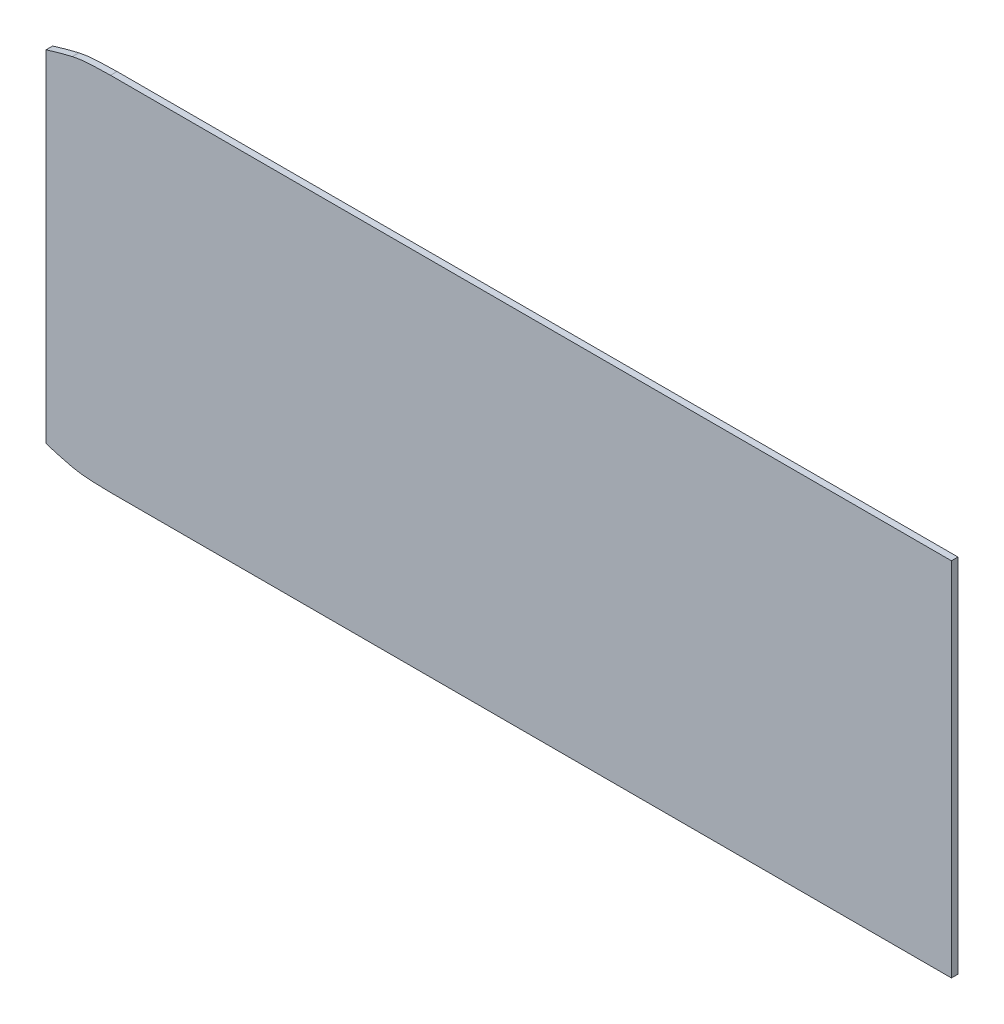
ISO-10303-21;
HEADER;
FILE_DESCRIPTION(('STEP AP214'),'2;1');
FILE_NAME('part.step','',(''),(''),'','','');
FILE_SCHEMA(('AUTOMOTIVE_DESIGN { 1 0 10303 214 1 1 1 1 }'));
ENDSEC;
DATA;
#1=APPLICATION_CONTEXT('core data for automotive mechanical design processes');
#2=APPLICATION_PROTOCOL_DEFINITION('international standard','automotive_design',2000,#1);
#3=PRODUCT_CONTEXT('',#1,'mechanical');
#4=PRODUCT('Part','Part','',(#3));
#5=PRODUCT_RELATED_PRODUCT_CATEGORY('part','',(#4));
#6=PRODUCT_DEFINITION_FORMATION('','',#4);
#7=PRODUCT_DEFINITION_CONTEXT('part definition',#1,'design');
#8=PRODUCT_DEFINITION('design','',#6,#7);
#9=PRODUCT_DEFINITION_SHAPE('','',#8);
#10=(LENGTH_UNIT() NAMED_UNIT(*) SI_UNIT(.MILLI.,.METRE.));
#11=(NAMED_UNIT(*) PLANE_ANGLE_UNIT() SI_UNIT($,.RADIAN.));
#12=(NAMED_UNIT(*) SI_UNIT($,.STERADIAN.) SOLID_ANGLE_UNIT());
#13=UNCERTAINTY_MEASURE_WITH_UNIT(LENGTH_MEASURE(1.E-05),#10,'distance_accuracy_value','');
#14=(GEOMETRIC_REPRESENTATION_CONTEXT(3) GLOBAL_UNCERTAINTY_ASSIGNED_CONTEXT((#13)) GLOBAL_UNIT_ASSIGNED_CONTEXT((#10,
#11,#12)) REPRESENTATION_CONTEXT('',''));
#15=CARTESIAN_POINT('',(0.,0.,0.));
#16=DIRECTION('',(0.,0.,1.));
#17=DIRECTION('',(1.,0.,0.));
#18=AXIS2_PLACEMENT_3D('',#15,#16,#17);
#19=CARTESIAN_POINT('',(158.,83.,3.));
#20=DIRECTION('',(0.,-1.,0.));
#21=DIRECTION('',(0.,0.,-1.));
#22=AXIS2_PLACEMENT_3D('',#19,#20,#21);
#23=PLANE('',#22);
#24=DIRECTION('',(-1.,0.,0.));
#25=VECTOR('',#24,1.);
#26=CARTESIAN_POINT('',(158.,83.,3.));
#27=LINE('',#26,#25);
#28=CARTESIAN_POINT('',(157.984004842846,83.,3.));
#29=VERTEX_POINT('',#28);
#30=CARTESIAN_POINT('',(-228.37389849842,82.9999998793761,3.));
#31=VERTEX_POINT('',#30);
#32=EDGE_CURVE('E124',#29,#31,#27,.T.);
#33=ORIENTED_EDGE('',*,*,#32,.F.);
#34=DIRECTION('',(0.,0.,-1.));
#35=VECTOR('',#34,1.);
#36=CARTESIAN_POINT('',(157.984004842846,83.,3.));
#37=LINE('',#36,#35);
#38=CARTESIAN_POINT('',(157.984004842846,83.,0.));
#39=VERTEX_POINT('',#38);
#40=EDGE_CURVE('E400',#29,#39,#37,.T.);
#41=ORIENTED_EDGE('',*,*,#40,.T.);
#42=DIRECTION('',(-1.,0.,0.));
#43=VECTOR('',#42,1.);
#44=CARTESIAN_POINT('',(158.,83.,0.));
#45=LINE('',#44,#43);
#46=CARTESIAN_POINT('',(-228.37389849842,82.9999998793761,0.));
#47=VERTEX_POINT('',#46);
#48=EDGE_CURVE('E222',#39,#47,#45,.T.);
#49=ORIENTED_EDGE('',*,*,#48,.T.);
#50=DIRECTION('',(0.,0.,-1.));
#51=VECTOR('',#50,1.);
#52=CARTESIAN_POINT('',(-228.37389849842,82.9999998793761,3.));
#53=LINE('',#52,#51);
#54=EDGE_CURVE('E307',#31,#47,#53,.T.);
#55=ORIENTED_EDGE('',*,*,#54,.F.);
#56=EDGE_LOOP('',(#33,#41,#49,#55));
#57=FACE_BOUND('',#56,.T.);
#58=ADVANCED_FACE('F121',(#57),#23,.F.);
#59=CARTESIAN_POINT('',(-258.,83.,3.));
#60=DIRECTION('',(1.,0.,0.));
#61=DIRECTION('',(0.,0.,-1.));
#62=AXIS2_PLACEMENT_3D('',#59,#60,#61);
#63=PLANE('',#62);
#64=DIRECTION('',(0.,-1.,0.));
#65=VECTOR('',#64,1.);
#66=CARTESIAN_POINT('',(-258.,83.,0.));
#67=LINE('',#66,#65);
#68=CARTESIAN_POINT('',(-257.999999903838,78.331787836265,0.));
#69=VERTEX_POINT('',#68);
#70=CARTESIAN_POINT('',(-258.000000000782,-78.3318450844403,0.));
#71=VERTEX_POINT('',#70);
#72=EDGE_CURVE('E333',#69,#71,#67,.T.);
#73=ORIENTED_EDGE('',*,*,#72,.T.);
#74=DIRECTION('',(0.,0.,-1.));
#75=VECTOR('',#74,1.);
#76=CARTESIAN_POINT('',(-258.,-78.3318657087253,3.));
#77=LINE('',#76,#75);
#78=CARTESIAN_POINT('',(-258.000000000785,-78.3318450844393,3.));
#79=VERTEX_POINT('',#78);
#80=EDGE_CURVE('E340',#71,#79,#77,.F.);
#81=ORIENTED_EDGE('',*,*,#80,.T.);
#82=DIRECTION('',(0.,-1.,0.));
#83=VECTOR('',#82,1.);
#84=CARTESIAN_POINT('',(-258.,83.,3.));
#85=LINE('',#84,#83);
#86=CARTESIAN_POINT('',(-257.999999903838,78.3317878362649,3.));
#87=VERTEX_POINT('',#86);
#88=EDGE_CURVE('E213',#87,#79,#85,.T.);
#89=ORIENTED_EDGE('',*,*,#88,.F.);
#90=DIRECTION('',(0.,0.,-1.));
#91=VECTOR('',#90,1.);
#92=CARTESIAN_POINT('',(-258.,78.3317881059395,3.));
#93=LINE('',#92,#91);
#94=EDGE_CURVE('E194',#87,#69,#93,.T.);
#95=ORIENTED_EDGE('',*,*,#94,.T.);
#96=EDGE_LOOP('',(#73,#81,#89,#95));
#97=FACE_BOUND('',#96,.T.);
#98=ADVANCED_FACE('F332',(#97),#63,.F.);
#99=CARTESIAN_POINT('',(-258.,-83.,3.));
#100=DIRECTION('',(0.,1.,0.));
#101=DIRECTION('',(0.,0.,1.));
#102=AXIS2_PLACEMENT_3D('',#99,#100,#101);
#103=PLANE('',#102);
#104=DIRECTION('',(1.,0.,0.));
#105=VECTOR('',#104,1.);
#106=CARTESIAN_POINT('',(-258.,-83.,3.));
#107=LINE('',#106,#105);
#108=CARTESIAN_POINT('',(-228.371279881388,-83.,3.));
#109=VERTEX_POINT('',#108);
#110=CARTESIAN_POINT('',(157.984004842846,-83.,3.));
#111=VERTEX_POINT('',#110);
#112=EDGE_CURVE('E352',#109,#111,#107,.T.);
#113=ORIENTED_EDGE('',*,*,#112,.F.);
#114=DIRECTION('',(0.,0.,-1.));
#115=VECTOR('',#114,1.);
#116=CARTESIAN_POINT('',(-228.371279881388,-83.,3.));
#117=LINE('',#116,#115);
#118=CARTESIAN_POINT('',(-228.371279881388,-83.,0.));
#119=VERTEX_POINT('',#118);
#120=EDGE_CURVE('E195',#109,#119,#117,.T.);
#121=ORIENTED_EDGE('',*,*,#120,.T.);
#122=DIRECTION('',(1.,0.,0.));
#123=VECTOR('',#122,1.);
#124=CARTESIAN_POINT('',(-258.,-83.,0.));
#125=LINE('',#124,#123);
#126=CARTESIAN_POINT('',(157.984004842846,-83.,0.));
#127=VERTEX_POINT('',#126);
#128=EDGE_CURVE('E337',#119,#127,#125,.T.);
#129=ORIENTED_EDGE('',*,*,#128,.T.);
#130=DIRECTION('',(0.,0.,1.));
#131=VECTOR('',#130,1.);
#132=CARTESIAN_POINT('',(157.984004842846,-83.,3.));
#133=LINE('',#132,#131);
#134=EDGE_CURVE('E334',#127,#111,#133,.T.);
#135=ORIENTED_EDGE('',*,*,#134,.T.);
#136=EDGE_LOOP('',(#113,#121,#129,#135));
#137=FACE_BOUND('',#136,.T.);
#138=ADVANCED_FACE('F234',(#137),#103,.F.);
#139=CARTESIAN_POINT('',(0.,0.,3.));
#140=DIRECTION('',(0.,0.,1.));
#141=DIRECTION('',(1.,0.,0.));
#142=AXIS2_PLACEMENT_3D('',#139,#140,#141);
#143=PLANE('',#142);
#144=CARTESIAN_POINT('',(-245.944918927692,-81.659654554092,3.));
#145=CARTESIAN_POINT('',(-248.243697448521,-81.1129730453286,3.));
#146=CARTESIAN_POINT('',(-250.534508221229,-80.5245902754165,3.));
#147=CARTESIAN_POINT('',(-254.54971348423,-79.3988032401642,3.));
#148=CARTESIAN_POINT('',(-256.278252151791,-78.8830885935074,3.));
#149=CARTESIAN_POINT('',(-258.000005989168,-78.3318637912749,3.));
#150=B_SPLINE_CURVE_WITH_KNOTS('',3,(#144,#145,#146,#147,#148,#149),.UNSPECIFIED.,.F.,.F.,(4,2,
4),(0.779967806411927,0.904967806411926,1.),.UNSPECIFIED.);
#151=CARTESIAN_POINT('',(-245.944918927692,-81.659654554092,3.));
#152=VERTEX_POINT('',#151);
#153=EDGE_CURVE('E189',#79,#152,#150,.F.);
#154=ORIENTED_EDGE('',*,*,#153,.T.);
#155=CARTESIAN_POINT('',(-228.371279881388,-83.,3.));
#156=CARTESIAN_POINT('',(-229.842588562149,-82.9999873050467,3.));
#157=CARTESIAN_POINT('',(-231.313015550475,-82.9776686468622,3.));
#158=CARTESIAN_POINT('',(-234.252964151787,-82.8970510019537,3.));
#159=CARTESIAN_POINT('',(-235.722483001563,-82.8386821087008,3.));
#160=CARTESIAN_POINT('',(-238.659345657935,-82.6669178398703,3.));
#161=CARTESIAN_POINT('',(-240.128214471379,-82.5540305128656,3.));
#162=CARTESIAN_POINT('',(-242.32177256187,-82.3032796165639,3.));
#163=CARTESIAN_POINT('',(-243.051197687619,-82.205725268395,3.));
#164=CARTESIAN_POINT('',(-244.504823749203,-81.9689769272569,3.));
#165=CARTESIAN_POINT('',(-245.228204162783,-81.8300877202851,3.));
#166=CARTESIAN_POINT('',(-245.944918927692,-81.659654554092,3.));
#167=B_SPLINE_CURVE_WITH_KNOTS('',3,(#155,#156,#157,#158,#159,#160,#161,#162,#163,#164,#165,
#166),.UNSPECIFIED.,.F.,.F.,(4,2,2,2,2,4),(-4.07436033666997E-06,0.249908139011781,
0.49990813901178,0.749908139011779,0.87490813901178,0.999912213372119),.UNSPECIFIED.);
#168=EDGE_CURVE('E198',#152,#109,#167,.F.);
#169=ORIENTED_EDGE('',*,*,#168,.T.);
#170=ORIENTED_EDGE('',*,*,#112,.T.);
#171=DIRECTION('',(0.,1.,0.));
#172=VECTOR('',#171,1.);
#173=CARTESIAN_POINT('',(157.984004842846,-83.0001279307093,3.));
#174=LINE('',#173,#172);
#175=EDGE_CURVE('E205',#111,#29,#174,.T.);
#176=ORIENTED_EDGE('',*,*,#175,.T.);
#177=ORIENTED_EDGE('',*,*,#32,.T.);
#178=CARTESIAN_POINT('',(-245.900726070636,81.6701266688324,3.));
#179=CARTESIAN_POINT('',(-245.186104012796,81.8398840906207,3.));
#180=CARTESIAN_POINT('',(-244.465500097974,81.9779846681044,3.));
#181=CARTESIAN_POINT('',(-243.016587255606,82.2134097916551,3.));
#182=CARTESIAN_POINT('',(-242.28856297364,82.3104675364092,3.));
#183=CARTESIAN_POINT('',(-240.100674412074,82.5595182632291,3.));
#184=CARTESIAN_POINT('',(-238.636271151521,82.671249619864,3.));
#185=CARTESIAN_POINT('',(-235.705718536026,82.8412179032682,3.));
#186=CARTESIAN_POINT('',(-234.238465029507,82.8987982174128,3.));
#187=CARTESIAN_POINT('',(-231.305822798078,82.9781303649455,3.));
#188=CARTESIAN_POINT('',(-229.840089174501,82.9999406951702,3.));
#189=CARTESIAN_POINT('',(-228.37389849842,82.9999998793761,3.));
#190=B_SPLINE_CURVE_WITH_KNOTS('',3,(#178,#179,#180,#181,#182,#183,#184,#185,#186,#187,#188,
#189),.UNSPECIFIED.,.F.,.F.,(4,2,2,2,2,4),(0.000327865941739391,0.125327865941738,
0.250327865941736,0.500327865941737,0.750327865941738,1.),.UNSPECIFIED.);
#191=CARTESIAN_POINT('',(-245.900726070636,81.6701266688324,3.));
#192=VERTEX_POINT('',#191);
#193=EDGE_CURVE('E258',#31,#192,#190,.F.);
#194=ORIENTED_EDGE('',*,*,#193,.T.);
#195=CARTESIAN_POINT('',(-257.999999991078,78.3317881087955,3.));
#196=CARTESIAN_POINT('',(-257.405276533728,78.5221654337286,3.));
#197=CARTESIAN_POINT('',(-256.809467381083,78.7083991896728,3.));
#198=CARTESIAN_POINT('',(-255.074519046184,79.2384520376858,3.));
#199=CARTESIAN_POINT('',(-253.933177982928,79.5718446955618,3.));
#200=CARTESIAN_POINT('',(-250.502051759121,80.5332444162679,3.));
#201=CARTESIAN_POINT('',(-248.205217512386,81.1226508512161,3.));
#202=CARTESIAN_POINT('',(-245.900726070636,81.6701266688324,3.));
#203=B_SPLINE_CURVE_WITH_KNOTS('',3,(#195,#196,#197,#198,#199,#200,#201,#202),.UNSPECIFIED.,.F.,
.F.,(4,2,2,4),(-1.11827684112775E-06,0.0327257601715361,0.0952257601715355,0.220226878448373),.UNSPECIFIED.);
#204=EDGE_CURVE('E260',#192,#87,#203,.F.);
#205=ORIENTED_EDGE('',*,*,#204,.T.);
#206=ORIENTED_EDGE('',*,*,#88,.T.);
#207=EDGE_LOOP('',(#154,#169,#170,#176,#177,#194,#205,#206));
#208=FACE_BOUND('',#207,.T.);
#209=ADVANCED_FACE('F210',(#208),#143,.T.);
#210=CARTESIAN_POINT('',(0.,0.,0.));
#211=DIRECTION('',(0.,0.,1.));
#212=DIRECTION('',(1.,0.,0.));
#213=AXIS2_PLACEMENT_3D('',#210,#211,#212);
#214=PLANE('',#213);
#215=CARTESIAN_POINT('',(-245.944918927692,-81.659654554092,0.));
#216=CARTESIAN_POINT('',(-245.228204162783,-81.8300877202851,0.));
#217=CARTESIAN_POINT('',(-244.504823749203,-81.9689769272569,0.));
#218=CARTESIAN_POINT('',(-243.051197687619,-82.205725268395,0.));
#219=CARTESIAN_POINT('',(-242.32177256187,-82.3032796165639,0.));
#220=CARTESIAN_POINT('',(-240.128214471379,-82.5540305128656,0.));
#221=CARTESIAN_POINT('',(-238.659345657935,-82.6669178398703,0.));
#222=CARTESIAN_POINT('',(-235.722483001563,-82.8386821087008,0.));
#223=CARTESIAN_POINT('',(-234.252964151787,-82.8970510019537,0.));
#224=CARTESIAN_POINT('',(-231.313015550475,-82.9776686468622,0.));
#225=CARTESIAN_POINT('',(-229.842588562149,-82.9999873050467,0.));
#226=CARTESIAN_POINT('',(-228.371279881388,-83.,0.));
#227=B_SPLINE_CURVE_WITH_KNOTS('',3,(#215,#216,#217,#218,#219,#220,#221,#222,#223,#224,#225,
#226),.UNSPECIFIED.,.F.,.F.,(4,2,2,2,2,4),(-4.07436033665741E-06,0.125000000000002,
0.250000000000003,0.500000000000002,0.750000000000001,0.999912213372119),.UNSPECIFIED.);
#228=CARTESIAN_POINT('',(-245.944918927692,-81.659654554092,0.));
#229=VERTEX_POINT('',#228);
#230=EDGE_CURVE('E373',#229,#119,#227,.T.);
#231=ORIENTED_EDGE('',*,*,#230,.F.);
#232=CARTESIAN_POINT('',(-258.000005989771,-78.3318637910818,0.));
#233=CARTESIAN_POINT('',(-256.278252152195,-78.883088593387,0.));
#234=CARTESIAN_POINT('',(-254.549713484432,-79.3988032401074,0.));
#235=CARTESIAN_POINT('',(-250.534508221229,-80.5245902754165,0.));
#236=CARTESIAN_POINT('',(-248.243697448521,-81.1129730453286,0.));
#237=CARTESIAN_POINT('',(-245.944918927692,-81.659654554092,0.));
#238=B_SPLINE_CURVE_WITH_KNOTS('',3,(#232,#233,#234,#235,#236,#237),.UNSPECIFIED.,.F.,.F.,(4,2,
4),(0.779967806400829,0.875000000000001,1.),.UNSPECIFIED.);
#239=EDGE_CURVE('E12',#229,#71,#238,.F.);
#240=ORIENTED_EDGE('',*,*,#239,.T.);
#241=ORIENTED_EDGE('',*,*,#72,.F.);
#242=CARTESIAN_POINT('',(-245.900726070636,81.6701266688324,0.));
#243=CARTESIAN_POINT('',(-248.205217512386,81.1226508512161,0.));
#244=CARTESIAN_POINT('',(-250.502051759121,80.5332444162679,0.));
#245=CARTESIAN_POINT('',(-253.933177982928,79.5718446955618,0.));
#246=CARTESIAN_POINT('',(-255.074519046184,79.2384520376858,0.));
#247=CARTESIAN_POINT('',(-256.809467381083,78.7083991896728,0.));
#248=CARTESIAN_POINT('',(-257.405276533727,78.5221654337287,0.));
#249=CARTESIAN_POINT('',(-257.999999991078,78.3317881087956,0.));
#250=B_SPLINE_CURVE_WITH_KNOTS('',3,(#242,#243,#244,#245,#246,#247,#248,#249),.UNSPECIFIED.,.F.,
.F.,(4,2,2,4),(-1.11827684114128E-06,0.124999999999996,0.187499999999996,0.220226878448365),.UNSPECIFIED.);
#251=CARTESIAN_POINT('',(-245.900726070636,81.6701266688324,0.));
#252=VERTEX_POINT('',#251);
#253=EDGE_CURVE('E214',#252,#69,#250,.T.);
#254=ORIENTED_EDGE('',*,*,#253,.F.);
#255=CARTESIAN_POINT('',(-228.37389849842,82.9999998793761,0.));
#256=CARTESIAN_POINT('',(-229.840089174501,82.9999406951702,0.));
#257=CARTESIAN_POINT('',(-231.305822798078,82.9781303649455,0.));
#258=CARTESIAN_POINT('',(-234.238465029507,82.8987982174128,0.));
#259=CARTESIAN_POINT('',(-235.705718536026,82.8412179032682,0.));
#260=CARTESIAN_POINT('',(-238.636271151521,82.671249619864,0.));
#261=CARTESIAN_POINT('',(-240.100674412074,82.5595182632291,0.));
#262=CARTESIAN_POINT('',(-242.28856297364,82.3104675364092,0.));
#263=CARTESIAN_POINT('',(-243.016587255606,82.2134097916551,0.));
#264=CARTESIAN_POINT('',(-244.465500097974,81.9779846681044,0.));
#265=CARTESIAN_POINT('',(-245.186104012796,81.8398840906207,0.));
#266=CARTESIAN_POINT('',(-245.900726070636,81.6701266688324,0.));
#267=B_SPLINE_CURVE_WITH_KNOTS('',3,(#255,#256,#257,#258,#259,#260,#261,#262,#263,#264,#265,
#266),.UNSPECIFIED.,.F.,.F.,(4,2,2,2,2,4),(0.000327865941739486,0.250000000000001,
0.500000000000002,0.750000000000004,0.875000000000002,1.),.UNSPECIFIED.);
#268=EDGE_CURVE('E145',#47,#252,#267,.T.);
#269=ORIENTED_EDGE('',*,*,#268,.F.);
#270=ORIENTED_EDGE('',*,*,#48,.F.);
#271=DIRECTION('',(0.,-1.,0.));
#272=VECTOR('',#271,1.);
#273=CARTESIAN_POINT('',(157.984004842846,0.,0.));
#274=LINE('',#273,#272);
#275=EDGE_CURVE('E130',#39,#127,#274,.T.);
#276=ORIENTED_EDGE('',*,*,#275,.T.);
#277=ORIENTED_EDGE('',*,*,#128,.F.);
#278=EDGE_LOOP('',(#231,#240,#241,#254,#269,#270,#276,#277));
#279=FACE_BOUND('',#278,.T.);
#280=ADVANCED_FACE('F233',(#279),#214,.F.);
#281=CARTESIAN_POINT('',(-245.900726070636,81.6701266688324,3.));
#282=CARTESIAN_POINT('',(-248.205217512386,81.1226508512161,3.));
#283=CARTESIAN_POINT('',(-250.502051759121,80.5332444162679,3.));
#284=CARTESIAN_POINT('',(-253.933177982928,79.5718446955618,3.));
#285=CARTESIAN_POINT('',(-255.074519046184,79.2384520376858,3.));
#286=CARTESIAN_POINT('',(-257.351906958043,78.542675728715,3.));
#287=CARTESIAN_POINT('',(-258.48897711709,78.1799471874665,3.));
#288=CARTESIAN_POINT('',(-261.881933444838,77.0456835700329,3.));
#289=CARTESIAN_POINT('',(-264.12157634773,76.2333612155715,3.));
#290=CARTESIAN_POINT('',(-267.42044593197,74.8625042695138,3.));
#291=CARTESIAN_POINT('',(-268.510428526776,74.3813094143009,3.));
#292=CARTESIAN_POINT('',(-270.668874710328,73.3648073700595,3.));
#293=CARTESIAN_POINT('',(-271.738347486457,72.8288267596237,3.));
#294=CARTESIAN_POINT('',(-274.882825626027,71.1440234445883,3.));
#295=CARTESIAN_POINT('',(-276.903403528541,69.91602215922,3.));
#296=CARTESIAN_POINT('',(-279.787470527441,67.8709001501436,3.));
#297=CARTESIAN_POINT('',(-280.724170551139,67.1550779563322,3.));
#298=CARTESIAN_POINT('',(-282.538375905569,65.641528645562,3.));
#299=CARTESIAN_POINT('',(-283.416023392917,64.8439982240499,3.));
#300=CARTESIAN_POINT('',(-285.096267432032,63.1450929179021,3.));
#301=CARTESIAN_POINT('',(-285.902526148502,62.2383764039947,3.));
#302=CARTESIAN_POINT('',(-287.371595107996,60.3385511105267,3.));
#303=CARTESIAN_POINT('',(-288.03964397863,59.3419866412326,3.));
#304=CARTESIAN_POINT('',(-288.906560983336,57.7523030565337,3.));
#305=CARTESIAN_POINT('',(-289.171480933363,57.2081289218276,3.));
#306=CARTESIAN_POINT('',(-289.638489379744,56.1032981218438,3.));
#307=CARTESIAN_POINT('',(-289.841779593571,55.5405968043653,3.));
#308=CARTESIAN_POINT('',(-290.178497748832,54.3914105807878,3.));
#309=CARTESIAN_POINT('',(-290.31208586418,53.8043648523648,3.));
#310=CARTESIAN_POINT('',(-290.495353853834,52.6042197843169,3.));
#311=CARTESIAN_POINT('',(-290.543405465351,52.0015132675226,3.));
#312=CARTESIAN_POINT('',(-290.54340610706,51.3959027006157,3.));
#313=B_SPLINE_CURVE_WITH_KNOTS('',3,(#281,#282,#283,#284,#285,#286,#287,#288,#289,#290,#291,
#292,#293,#294,#295,#296,#297,#298,#299,#300,#301,#302,#303,#304,#305,#306,#307,#308,#309,#310,
#311,#312),.UNSPECIFIED.,.F.,.F.,(4,2,2,2,2,2,2,2,2,2,2,2,2,2,2,4),(-1.11827684114128E-06,
0.124999999999996,0.187499999999996,0.249999999999995,0.374999999999994,0.437499999999995,
0.499999999999995,0.624999999999997,0.687499999999997,0.749999999999998,0.812499999999998,
0.874999999999999,0.906249999999999,0.937499999999999,0.96875,1.00000000000305),.UNSPECIFIED.);
#314=DIRECTION('',(0.,0.,-1.));
#315=VECTOR('',#314,1.);
#316=SURFACE_OF_LINEAR_EXTRUSION('',#313,#315);
#317=ORIENTED_EDGE('',*,*,#204,.F.);
#318=DIRECTION('',(0.,0.,-1.));
#319=VECTOR('',#318,1.);
#320=CARTESIAN_POINT('',(-245.900726070636,81.6701266688324,3.));
#321=LINE('',#320,#319);
#322=EDGE_CURVE('E265',#192,#252,#321,.T.);
#323=ORIENTED_EDGE('',*,*,#322,.T.);
#324=ORIENTED_EDGE('',*,*,#253,.T.);
#325=ORIENTED_EDGE('',*,*,#94,.F.);
#326=EDGE_LOOP('',(#317,#323,#324,#325));
#327=FACE_BOUND('',#326,.T.);
#328=ADVANCED_FACE('F291',(#327),#316,.F.);
#329=CARTESIAN_POINT('',(-228.368122353012,83.,3.));
#330=CARTESIAN_POINT('',(-229.836239612215,82.9999979464627,3.));
#331=CARTESIAN_POINT('',(-231.303898509246,82.978182419698,3.));
#332=CARTESIAN_POINT('',(-234.238465029507,82.8987982174128,3.));
#333=CARTESIAN_POINT('',(-235.705718536026,82.8412179032682,3.));
#334=CARTESIAN_POINT('',(-238.636271151521,82.671249619864,3.));
#335=CARTESIAN_POINT('',(-240.100674412074,82.5595182632291,3.));
#336=CARTESIAN_POINT('',(-242.28856297364,82.3104675364092,3.));
#337=CARTESIAN_POINT('',(-243.016587255606,82.2134097916551,3.));
#338=CARTESIAN_POINT('',(-244.465500097974,81.9779846681044,3.));
#339=CARTESIAN_POINT('',(-245.186104012796,81.8398840906207,3.));
#340=CARTESIAN_POINT('',(-245.900726070636,81.6701266688324,3.));
#341=B_SPLINE_CURVE_WITH_KNOTS('',3,(#329,#330,#331,#332,#333,#334,#335,#336,#337,#338,#339,
#340),.UNSPECIFIED.,.F.,.F.,(4,2,2,2,2,4),(0.,0.250000000000001,0.500000000000002,
0.750000000000004,0.875000000000002,1.),.UNSPECIFIED.);
#342=DIRECTION('',(0.,0.,-1.));
#343=VECTOR('',#342,1.);
#344=SURFACE_OF_LINEAR_EXTRUSION('',#341,#343);
#345=ORIENTED_EDGE('',*,*,#268,.T.);
#346=ORIENTED_EDGE('',*,*,#322,.F.);
#347=ORIENTED_EDGE('',*,*,#193,.F.);
#348=ORIENTED_EDGE('',*,*,#54,.T.);
#349=EDGE_LOOP('',(#345,#346,#347,#348));
#350=FACE_BOUND('',#349,.T.);
#351=ADVANCED_FACE('F285',(#350),#344,.F.);
#352=CARTESIAN_POINT('',(157.984004842846,-83.0001279307093,3.));
#353=DIRECTION('',(-1.,0.,0.));
#354=DIRECTION('',(0.,-1.,0.));
#355=AXIS2_PLACEMENT_3D('',#352,#353,#354);
#356=PLANE('',#355);
#357=ORIENTED_EDGE('',*,*,#175,.F.);
#358=ORIENTED_EDGE('',*,*,#134,.F.);
#359=ORIENTED_EDGE('',*,*,#275,.F.);
#360=ORIENTED_EDGE('',*,*,#40,.F.);
#361=EDGE_LOOP('',(#357,#358,#359,#360));
#362=FACE_BOUND('',#361,.T.);
#363=ADVANCED_FACE('F290',(#362),#356,.F.);
#364=CARTESIAN_POINT('',(-290.54340610706,-51.3959027006158,3.));
#365=CARTESIAN_POINT('',(-290.543405436723,-52.6031362942188,3.));
#366=CARTESIAN_POINT('',(-290.354571848797,-53.7819325056451,3.));
#367=CARTESIAN_POINT('',(-289.934067536454,-55.2276485788343,3.));
#368=CARTESIAN_POINT('',(-289.840250269053,-55.5162967640833,3.));
#369=CARTESIAN_POINT('',(-289.637158485515,-56.0844192336452,3.));
#370=CARTESIAN_POINT('',(-289.527832326279,-56.3643151816903,3.));
#371=CARTESIAN_POINT('',(-289.178656792317,-57.1926548533334,3.));
#372=CARTESIAN_POINT('',(-288.917702189482,-57.7297995660587,3.));
#373=CARTESIAN_POINT('',(-288.34801158278,-58.7785084781433,3.));
#374=CARTESIAN_POINT('',(-288.039236394497,-59.2900516995184,3.));
#375=CARTESIAN_POINT('',(-287.379850674629,-60.2907409430355,3.));
#376=CARTESIAN_POINT('',(-287.027858272209,-60.7815761218483,3.));
#377=CARTESIAN_POINT('',(-285.926827906284,-62.209839295278,3.));
#378=CARTESIAN_POINT('',(-285.135284618042,-63.1023954876017,3.));
#379=CARTESIAN_POINT('',(-283.465218758971,-64.797358954823,3.));
#380=CARTESIAN_POINT('',(-282.586390648895,-65.5994495562382,3.));
#381=CARTESIAN_POINT('',(-281.214494598001,-66.7469763572627,3.));
#382=CARTESIAN_POINT('',(-280.748188351039,-67.1201494806301,3.));
#383=CARTESIAN_POINT('',(-279.798961271692,-67.8492756854798,3.));
#384=CARTESIAN_POINT('',(-279.315190682367,-68.2057989211001,3.));
#385=CARTESIAN_POINT('',(-276.873707217665,-69.9371530121868,3.));
#386=CARTESIAN_POINT('',(-274.842197477636,-71.1673296943799,3.));
#387=CARTESIAN_POINT('',(-270.665212935693,-73.4022837974426,3.));
#388=CARTESIAN_POINT('',(-268.519093680707,-74.405786623761,3.));
#389=CARTESIAN_POINT('',(-265.230043925059,-75.772850764095,3.));
#390=CARTESIAN_POINT('',(-264.121934534512,-76.2052810136326,3.));
#391=CARTESIAN_POINT('',(-261.884133209299,-77.0274557156609,3.));
#392=CARTESIAN_POINT('',(-260.756238170798,-77.421957318739,3.));
#393=CARTESIAN_POINT('',(-257.367859583379,-78.5549017209261,3.));
#394=CARTESIAN_POINT('',(-255.096573887081,-79.2454740050948,3.));
#395=CARTESIAN_POINT('',(-250.534508221229,-80.5245902754165,3.));
#396=CARTESIAN_POINT('',(-248.243697448521,-81.1129730453286,3.));
#397=CARTESIAN_POINT('',(-245.944918927692,-81.659654554092,3.));
#398=B_SPLINE_CURVE_WITH_KNOTS('',3,(#364,#365,#366,#367,#368,#369,#370,#371,#372,#373,#374,
#375,#376,#377,#378,#379,#380,#381,#382,#383,#384,#385,#386,#387,#388,#389,#390,#391,#392,#393,
#394,#395,#396,#397),.UNSPECIFIED.,.F.,.F.,(4,2,2,2,2,2,2,2,2,2,2,2,2,2,2,2,4),(0.,0.0625,
0.0781250000000002,0.0937500000000003,0.125000000000001,0.156250000000001,0.187500000000001,
0.250000000000002,0.312500000000003,0.343750000000004,0.375000000000004,0.500000000000003,
0.625000000000002,0.687500000000002,0.750000000000001,0.875000000000001,1.),.UNSPECIFIED.);
#399=DIRECTION('',(0.,0.,-1.));
#400=VECTOR('',#399,1.);
#401=SURFACE_OF_LINEAR_EXTRUSION('',#398,#400);
#402=ORIENTED_EDGE('',*,*,#239,.F.);
#403=DIRECTION('',(0.,0.,-1.));
#404=VECTOR('',#403,1.);
#405=CARTESIAN_POINT('',(-245.944918927692,-81.659654554092,3.));
#406=LINE('',#405,#404);
#407=EDGE_CURVE('E137',#152,#229,#406,.T.);
#408=ORIENTED_EDGE('',*,*,#407,.F.);
#409=ORIENTED_EDGE('',*,*,#153,.F.);
#410=ORIENTED_EDGE('',*,*,#80,.F.);
#411=EDGE_LOOP('',(#402,#408,#409,#410));
#412=FACE_BOUND('',#411,.T.);
#413=ADVANCED_FACE('F187',(#412),#401,.F.);
#414=CARTESIAN_POINT('',(-245.944918927692,-81.659654554092,3.));
#415=CARTESIAN_POINT('',(-245.228204162783,-81.8300877202851,3.));
#416=CARTESIAN_POINT('',(-244.504823749203,-81.9689769272569,3.));
#417=CARTESIAN_POINT('',(-243.051197687619,-82.205725268395,3.));
#418=CARTESIAN_POINT('',(-242.32177256187,-82.3032796165639,3.));
#419=CARTESIAN_POINT('',(-240.128214471379,-82.5540305128656,3.));
#420=CARTESIAN_POINT('',(-238.659345657935,-82.6669178398703,3.));
#421=CARTESIAN_POINT('',(-235.722483001563,-82.8386821087008,3.));
#422=CARTESIAN_POINT('',(-234.252964151787,-82.8970510019537,3.));
#423=CARTESIAN_POINT('',(-231.313015550475,-82.9776686468622,3.));
#424=CARTESIAN_POINT('',(-229.842588562149,-82.9999873050467,3.));
#425=CARTESIAN_POINT('',(-228.371279881388,-83.,3.));
#426=B_SPLINE_CURVE_WITH_KNOTS('',3,(#414,#415,#416,#417,#418,#419,#420,#421,#422,#423,#424,
#425),.UNSPECIFIED.,.F.,.F.,(4,2,2,2,2,4),(-4.07436033665741E-06,0.125000000000002,
0.250000000000003,0.500000000000002,0.750000000000001,0.999912213372119),.UNSPECIFIED.);
#427=DIRECTION('',(0.,0.,-1.));
#428=VECTOR('',#427,1.);
#429=SURFACE_OF_LINEAR_EXTRUSION('',#426,#428);
#430=ORIENTED_EDGE('',*,*,#230,.T.);
#431=ORIENTED_EDGE('',*,*,#120,.F.);
#432=ORIENTED_EDGE('',*,*,#168,.F.);
#433=ORIENTED_EDGE('',*,*,#407,.T.);
#434=EDGE_LOOP('',(#430,#431,#432,#433));
#435=FACE_BOUND('',#434,.T.);
#436=ADVANCED_FACE('F200',(#435),#429,.F.);
#437=CLOSED_SHELL('',(#58,#98,#138,#209,#280,#328,#351,#363,#413,#436));
#438=MANIFOLD_SOLID_BREP('B2',#437);
#439=ADVANCED_BREP_SHAPE_REPRESENTATION('',(#18,#438),#14);
#440=SHAPE_DEFINITION_REPRESENTATION(#9,#439);
ENDSEC;
END-ISO-10303-21;
